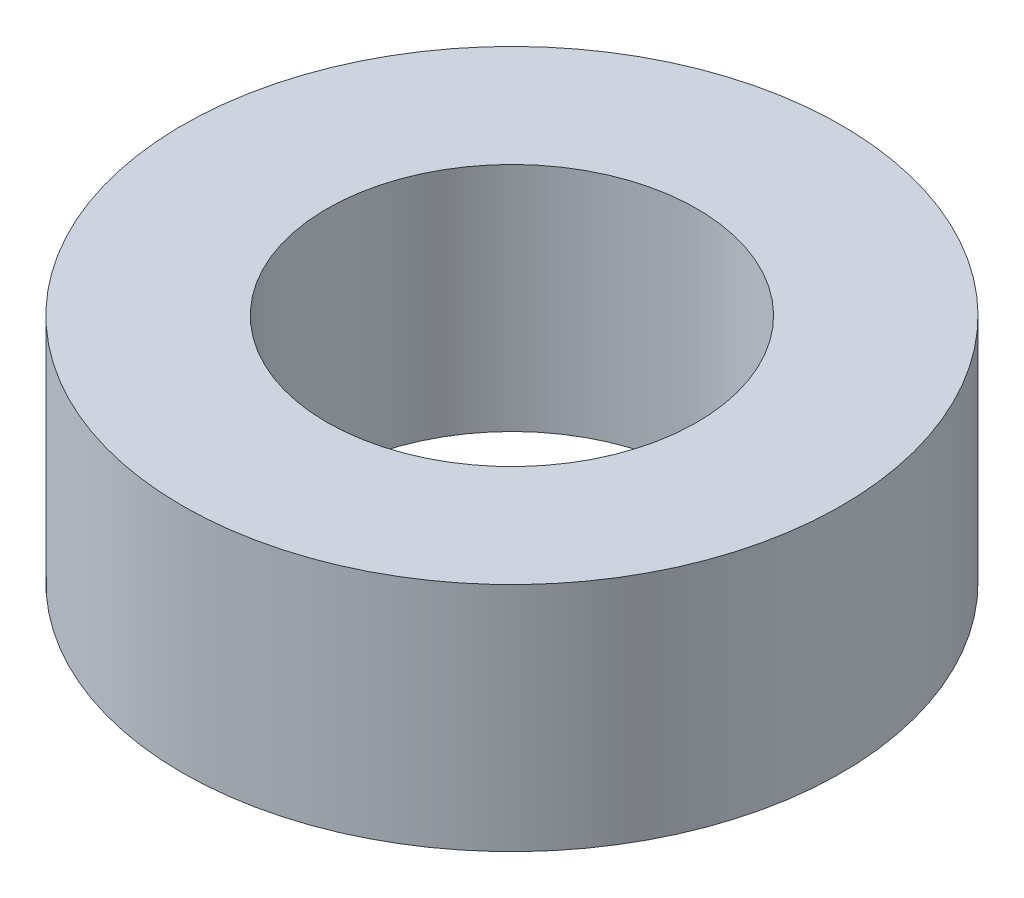
ISO-10303-21;
HEADER;
FILE_DESCRIPTION(('STEP AP214'),'2;1');
FILE_NAME('part.step','',(''),(''),'','','');
FILE_SCHEMA(('AUTOMOTIVE_DESIGN { 1 0 10303 214 1 1 1 1 }'));
ENDSEC;
DATA;
#1=APPLICATION_CONTEXT('core data for automotive mechanical design processes');
#2=APPLICATION_PROTOCOL_DEFINITION('international standard','automotive_design',2000,#1);
#3=PRODUCT_CONTEXT('',#1,'mechanical');
#4=PRODUCT('Part','Part','',(#3));
#5=PRODUCT_RELATED_PRODUCT_CATEGORY('part','',(#4));
#6=PRODUCT_DEFINITION_FORMATION('','',#4);
#7=PRODUCT_DEFINITION_CONTEXT('part definition',#1,'design');
#8=PRODUCT_DEFINITION('design','',#6,#7);
#9=PRODUCT_DEFINITION_SHAPE('','',#8);
#10=(LENGTH_UNIT() NAMED_UNIT(*) SI_UNIT(.MILLI.,.METRE.));
#11=(NAMED_UNIT(*) PLANE_ANGLE_UNIT() SI_UNIT($,.RADIAN.));
#12=(NAMED_UNIT(*) SI_UNIT($,.STERADIAN.) SOLID_ANGLE_UNIT());
#13=UNCERTAINTY_MEASURE_WITH_UNIT(LENGTH_MEASURE(1.E-05),#10,'distance_accuracy_value','');
#14=(GEOMETRIC_REPRESENTATION_CONTEXT(3) GLOBAL_UNCERTAINTY_ASSIGNED_CONTEXT((#13)) GLOBAL_UNIT_ASSIGNED_CONTEXT((#10,
#11,#12)) REPRESENTATION_CONTEXT('',''));
#15=CARTESIAN_POINT('',(0.,0.,0.));
#16=DIRECTION('',(0.,0.,1.));
#17=DIRECTION('',(1.,0.,0.));
#18=AXIS2_PLACEMENT_3D('',#15,#16,#17);
#19=CARTESIAN_POINT('',(0.,10.,0.));
#20=DIRECTION('',(0.,1.,0.));
#21=DIRECTION('',(0.,0.,1.));
#22=AXIS2_PLACEMENT_3D('',#19,#20,#21);
#23=PLANE('',#22);
#24=CARTESIAN_POINT('',(0.,10.,0.));
#25=DIRECTION('',(0.,1.,0.));
#26=DIRECTION('',(0.,0.,1.));
#27=AXIS2_PLACEMENT_3D('',#24,#25,#26);
#28=CIRCLE('',#27,28.5);
#29=CARTESIAN_POINT('',(0.,10.,28.5));
#30=VERTEX_POINT('',#29);
#31=EDGE_CURVE('E10',#30,#30,#28,.T.);
#32=ORIENTED_EDGE('',*,*,#31,.T.);
#33=EDGE_LOOP('',(#32));
#34=FACE_BOUND('',#33,.T.);
#35=CARTESIAN_POINT('',(0.,10.,0.));
#36=DIRECTION('',(0.,1.,0.));
#37=DIRECTION('',(0.,0.,1.));
#38=AXIS2_PLACEMENT_3D('',#35,#36,#37);
#39=CIRCLE('',#38,16.);
#40=CARTESIAN_POINT('',(0.,10.,16.));
#41=VERTEX_POINT('',#40);
#42=EDGE_CURVE('E42',#41,#41,#39,.T.);
#43=ORIENTED_EDGE('',*,*,#42,.F.);
#44=EDGE_LOOP('',(#43));
#45=FACE_BOUND('',#44,.T.);
#46=ADVANCED_FACE('F31',(#34,#45),#23,.T.);
#47=CARTESIAN_POINT('',(0.,-10.,0.));
#48=DIRECTION('',(0.,1.,0.));
#49=DIRECTION('',(0.,0.,1.));
#50=AXIS2_PLACEMENT_3D('',#47,#48,#49);
#51=PLANE('',#50);
#52=CARTESIAN_POINT('',(0.,-10.,0.));
#53=DIRECTION('',(0.,1.,0.));
#54=DIRECTION('',(0.,0.,1.));
#55=AXIS2_PLACEMENT_3D('',#52,#53,#54);
#56=CIRCLE('',#55,28.5);
#57=CARTESIAN_POINT('',(0.,-10.,28.5));
#58=VERTEX_POINT('',#57);
#59=EDGE_CURVE('E35',#58,#58,#56,.T.);
#60=ORIENTED_EDGE('',*,*,#59,.F.);
#61=EDGE_LOOP('',(#60));
#62=FACE_BOUND('',#61,.T.);
#63=CARTESIAN_POINT('',(0.,-10.,0.));
#64=DIRECTION('',(0.,1.,0.));
#65=DIRECTION('',(0.,0.,1.));
#66=AXIS2_PLACEMENT_3D('',#63,#64,#65);
#67=CIRCLE('',#66,16.);
#68=CARTESIAN_POINT('',(0.,-10.,16.));
#69=VERTEX_POINT('',#68);
#70=EDGE_CURVE('E44',#69,#69,#67,.T.);
#71=ORIENTED_EDGE('',*,*,#70,.T.);
#72=EDGE_LOOP('',(#71));
#73=FACE_BOUND('',#72,.T.);
#74=ADVANCED_FACE('F54',(#62,#73),#51,.F.);
#75=CARTESIAN_POINT('',(0.,10.,0.));
#76=DIRECTION('',(0.,-1.,0.));
#77=DIRECTION('',(0.,0.,-1.));
#78=AXIS2_PLACEMENT_3D('',#75,#76,#77);
#79=CYLINDRICAL_SURFACE('',#78,28.5);
#80=ORIENTED_EDGE('',*,*,#31,.F.);
#81=EDGE_LOOP('',(#80));
#82=FACE_BOUND('',#81,.T.);
#83=ORIENTED_EDGE('',*,*,#59,.T.);
#84=EDGE_LOOP('',(#83));
#85=FACE_BOUND('',#84,.T.);
#86=ADVANCED_FACE('F33',(#82,#85),#79,.T.);
#87=CARTESIAN_POINT('',(0.,10.,0.));
#88=DIRECTION('',(0.,-1.,0.));
#89=DIRECTION('',(0.,0.,-1.));
#90=AXIS2_PLACEMENT_3D('',#87,#88,#89);
#91=CYLINDRICAL_SURFACE('',#90,16.);
#92=ORIENTED_EDGE('',*,*,#42,.T.);
#93=EDGE_LOOP('',(#92));
#94=FACE_BOUND('',#93,.T.);
#95=ORIENTED_EDGE('',*,*,#70,.F.);
#96=EDGE_LOOP('',(#95));
#97=FACE_BOUND('',#96,.T.);
#98=ADVANCED_FACE('F50',(#94,#97),#91,.F.);
#99=CLOSED_SHELL('',(#46,#74,#86,#98));
#100=MANIFOLD_SOLID_BREP('B2',#99);
#101=ADVANCED_BREP_SHAPE_REPRESENTATION('',(#18,#100),#14);
#102=SHAPE_DEFINITION_REPRESENTATION(#9,#101);
ENDSEC;
END-ISO-10303-21;
